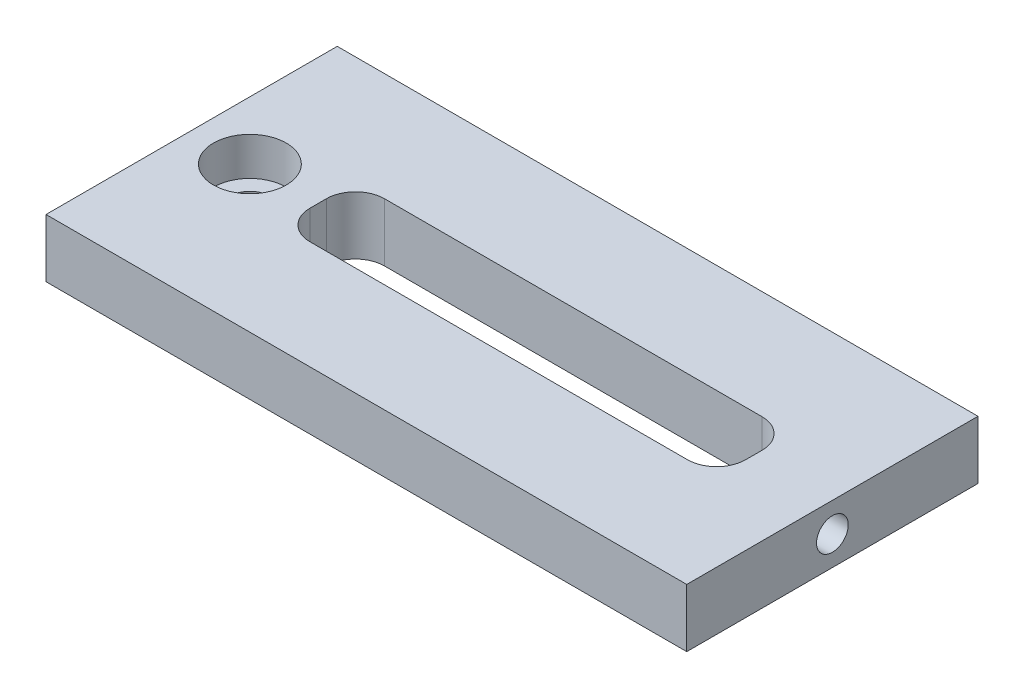
ISO-10303-21;
HEADER;
FILE_DESCRIPTION(('STEP AP214'),'2;1');
FILE_NAME('part.step','',(''),(''),'','','');
FILE_SCHEMA(('AUTOMOTIVE_DESIGN { 1 0 10303 214 1 1 1 1 }'));
ENDSEC;
DATA;
#1=APPLICATION_CONTEXT('core data for automotive mechanical design processes');
#2=APPLICATION_PROTOCOL_DEFINITION('international standard','automotive_design',2000,#1);
#3=PRODUCT_CONTEXT('',#1,'mechanical');
#4=PRODUCT('Part','Part','',(#3));
#5=PRODUCT_RELATED_PRODUCT_CATEGORY('part','',(#4));
#6=PRODUCT_DEFINITION_FORMATION('','',#4);
#7=PRODUCT_DEFINITION_CONTEXT('part definition',#1,'design');
#8=PRODUCT_DEFINITION('design','',#6,#7);
#9=PRODUCT_DEFINITION_SHAPE('','',#8);
#10=(LENGTH_UNIT() NAMED_UNIT(*) SI_UNIT(.MILLI.,.METRE.));
#11=(NAMED_UNIT(*) PLANE_ANGLE_UNIT() SI_UNIT($,.RADIAN.));
#12=(NAMED_UNIT(*) SI_UNIT($,.STERADIAN.) SOLID_ANGLE_UNIT());
#13=UNCERTAINTY_MEASURE_WITH_UNIT(LENGTH_MEASURE(1.E-05),#10,'distance_accuracy_value','');
#14=(GEOMETRIC_REPRESENTATION_CONTEXT(3) GLOBAL_UNCERTAINTY_ASSIGNED_CONTEXT((#13)) GLOBAL_UNIT_ASSIGNED_CONTEXT((#10,
#11,#12)) REPRESENTATION_CONTEXT('',''));
#15=CARTESIAN_POINT('',(0.,0.,0.));
#16=DIRECTION('',(0.,0.,1.));
#17=DIRECTION('',(1.,0.,0.));
#18=AXIS2_PLACEMENT_3D('',#15,#16,#17);
#19=CARTESIAN_POINT('',(26.3652,-3.175,4.064));
#20=DIRECTION('',(1.,0.,0.));
#21=DIRECTION('',(0.,0.,-1.));
#22=AXIS2_PLACEMENT_3D('',#19,#20,#21);
#23=PLANE('',#22);
#24=DIRECTION('',(0.,1.,0.));
#25=VECTOR('',#24,1.);
#26=CARTESIAN_POINT('',(26.3652,-3.175,-0.889000000000001));
#27=LINE('',#26,#25);
#28=CARTESIAN_POINT('',(26.3652,3.175,-0.889000000000001));
#29=VERTEX_POINT('',#28);
#30=CARTESIAN_POINT('',(26.3652,1.48084396207028,-0.889000000000001));
#31=VERTEX_POINT('',#30);
#32=EDGE_CURVE('E164',#29,#31,#27,.F.);
#33=ORIENTED_EDGE('',*,*,#32,.T.);
#34=CARTESIAN_POINT('',(26.3652,0.,0.));
#35=DIRECTION('',(1.,0.,0.));
#36=DIRECTION('',(0.,0.,-1.));
#37=AXIS2_PLACEMENT_3D('',#34,#35,#36);
#38=CIRCLE('',#37,1.72719999999999);
#39=CARTESIAN_POINT('',(26.3652,1.48084396207028,0.888999999999999));
#40=VERTEX_POINT('',#39);
#41=EDGE_CURVE('E11',#31,#40,#38,.T.);
#42=ORIENTED_EDGE('',*,*,#41,.T.);
#43=DIRECTION('',(0.,1.,0.));
#44=VECTOR('',#43,1.);
#45=CARTESIAN_POINT('',(26.3652,3.175,0.888999999999999));
#46=LINE('',#45,#44);
#47=CARTESIAN_POINT('',(26.3652,3.175,0.888999999999999));
#48=VERTEX_POINT('',#47);
#49=EDGE_CURVE('E172',#40,#48,#46,.T.);
#50=ORIENTED_EDGE('',*,*,#49,.T.);
#51=DIRECTION('',(0.,0.,-1.));
#52=VECTOR('',#51,1.);
#53=CARTESIAN_POINT('',(26.3652,3.175,4.064));
#54=LINE('',#53,#52);
#55=EDGE_CURVE('E170',#48,#29,#54,.T.);
#56=ORIENTED_EDGE('',*,*,#55,.T.);
#57=EDGE_LOOP('',(#33,#42,#50,#56));
#58=FACE_BOUND('',#57,.T.);
#59=ADVANCED_FACE('F42',(#58),#23,.F.);
#60=CARTESIAN_POINT('',(0.,3.175,0.));
#61=DIRECTION('',(0.,-1.,0.));
#62=DIRECTION('',(0.,0.,-1.));
#63=AXIS2_PLACEMENT_3D('',#60,#61,#62);
#64=PLANE('',#63);
#65=CARTESIAN_POINT('',(-28.575,3.175,0.));
#66=DIRECTION('',(0.,1.,0.));
#67=DIRECTION('',(0.,0.,1.));
#68=AXIS2_PLACEMENT_3D('',#65,#66,#67);
#69=CIRCLE('',#68,3.96875);
#70=CARTESIAN_POINT('',(-28.575,3.175,3.96875));
#71=VERTEX_POINT('',#70);
#72=EDGE_CURVE('E157',#71,#71,#69,.T.);
#73=ORIENTED_EDGE('',*,*,#72,.F.);
#74=EDGE_LOOP('',(#73));
#75=FACE_BOUND('',#74,.T.);
#76=DIRECTION('',(0.,0.,-1.));
#77=VECTOR('',#76,1.);
#78=CARTESIAN_POINT('',(-34.925,3.175,15.875));
#79=LINE('',#78,#77);
#80=CARTESIAN_POINT('',(-34.925,3.175,15.875));
#81=VERTEX_POINT('',#80);
#82=CARTESIAN_POINT('',(-34.925,3.175,-15.875));
#83=VERTEX_POINT('',#82);
#84=EDGE_CURVE('E231',#81,#83,#79,.T.);
#85=ORIENTED_EDGE('',*,*,#84,.F.);
#86=DIRECTION('',(1.,0.,0.));
#87=VECTOR('',#86,1.);
#88=CARTESIAN_POINT('',(-34.925,3.175,15.875));
#89=LINE('',#88,#87);
#90=CARTESIAN_POINT('',(34.925,3.175,15.875));
#91=VERTEX_POINT('',#90);
#92=EDGE_CURVE('E200',#81,#91,#89,.T.);
#93=ORIENTED_EDGE('',*,*,#92,.T.);
#94=DIRECTION('',(0.,0.,-1.));
#95=VECTOR('',#94,1.);
#96=CARTESIAN_POINT('',(34.925,3.175,15.875));
#97=LINE('',#96,#95);
#98=CARTESIAN_POINT('',(34.925,3.175,-15.875));
#99=VERTEX_POINT('',#98);
#100=EDGE_CURVE('E206',#91,#99,#97,.T.);
#101=ORIENTED_EDGE('',*,*,#100,.T.);
#102=DIRECTION('',(1.,0.,0.));
#103=VECTOR('',#102,1.);
#104=CARTESIAN_POINT('',(-34.925,3.175,-15.875));
#105=LINE('',#104,#103);
#106=EDGE_CURVE('E212',#83,#99,#105,.T.);
#107=ORIENTED_EDGE('',*,*,#106,.F.);
#108=EDGE_LOOP('',(#85,#93,#101,#107));
#109=FACE_BOUND('',#108,.T.);
#110=DIRECTION('',(1.,0.,0.));
#111=VECTOR('',#110,1.);
#112=CARTESIAN_POINT('',(-21.1328,3.175,4.064));
#113=LINE('',#112,#111);
#114=CARTESIAN_POINT('',(-17.9578,3.175,4.064));
#115=VERTEX_POINT('',#114);
#116=CARTESIAN_POINT('',(23.1902,3.175,4.064));
#117=VERTEX_POINT('',#116);
#118=EDGE_CURVE('E237',#115,#117,#113,.T.);
#119=ORIENTED_EDGE('',*,*,#118,.F.);
#120=CARTESIAN_POINT('',(-17.9578,3.175,0.888999999999999));
#121=DIRECTION('',(0.,-1.,0.));
#122=DIRECTION('',(0.,0.,-1.));
#123=AXIS2_PLACEMENT_3D('',#120,#121,#122);
#124=CIRCLE('',#123,3.175);
#125=CARTESIAN_POINT('',(-21.1328,3.175,0.888999999999999));
#126=VERTEX_POINT('',#125);
#127=EDGE_CURVE('E289',#115,#126,#124,.T.);
#128=ORIENTED_EDGE('',*,*,#127,.T.);
#129=DIRECTION('',(0.,0.,-1.));
#130=VECTOR('',#129,1.);
#131=CARTESIAN_POINT('',(-21.1328,3.175,4.064));
#132=LINE('',#131,#130);
#133=CARTESIAN_POINT('',(-21.1328,3.175,-0.889000000000001));
#134=VERTEX_POINT('',#133);
#135=EDGE_CURVE('E248',#126,#134,#132,.T.);
#136=ORIENTED_EDGE('',*,*,#135,.T.);
#137=CARTESIAN_POINT('',(-17.9578,3.175,-0.889000000000001));
#138=DIRECTION('',(0.,-1.,0.));
#139=DIRECTION('',(0.,0.,-1.));
#140=AXIS2_PLACEMENT_3D('',#137,#138,#139);
#141=CIRCLE('',#140,3.175);
#142=CARTESIAN_POINT('',(-17.9578,3.175,-4.064));
#143=VERTEX_POINT('',#142);
#144=EDGE_CURVE('E294',#134,#143,#141,.T.);
#145=ORIENTED_EDGE('',*,*,#144,.T.);
#146=DIRECTION('',(1.,0.,0.));
#147=VECTOR('',#146,1.);
#148=CARTESIAN_POINT('',(-21.1328,3.175,-4.064));
#149=LINE('',#148,#147);
#150=CARTESIAN_POINT('',(23.1902,3.175,-4.064));
#151=VERTEX_POINT('',#150);
#152=EDGE_CURVE('E244',#143,#151,#149,.T.);
#153=ORIENTED_EDGE('',*,*,#152,.T.);
#154=CARTESIAN_POINT('',(23.1902,3.175,-0.889000000000001));
#155=DIRECTION('',(0.,-1.,0.));
#156=DIRECTION('',(0.,0.,-1.));
#157=AXIS2_PLACEMENT_3D('',#154,#155,#156);
#158=CIRCLE('',#157,3.175);
#159=EDGE_CURVE('E300',#151,#29,#158,.T.);
#160=ORIENTED_EDGE('',*,*,#159,.T.);
#161=ORIENTED_EDGE('',*,*,#55,.F.);
#162=CARTESIAN_POINT('',(23.1902,3.175,0.888999999999999));
#163=DIRECTION('',(0.,-1.,0.));
#164=DIRECTION('',(0.,0.,-1.));
#165=AXIS2_PLACEMENT_3D('',#162,#163,#164);
#166=CIRCLE('',#165,3.175);
#167=EDGE_CURVE('E306',#48,#117,#166,.T.);
#168=ORIENTED_EDGE('',*,*,#167,.T.);
#169=EDGE_LOOP('',(#119,#128,#136,#145,#153,#160,#161,#168));
#170=FACE_BOUND('',#169,.T.);
#171=ADVANCED_FACE('F343',(#75,#109,#170),#64,.F.);
#172=CARTESIAN_POINT('',(0.,-3.175,0.));
#173=DIRECTION('',(0.,-1.,0.));
#174=DIRECTION('',(0.,0.,-1.));
#175=AXIS2_PLACEMENT_3D('',#172,#173,#174);
#176=PLANE('',#175);
#177=CARTESIAN_POINT('',(-28.575,-3.175,0.));
#178=DIRECTION('',(0.,-1.,0.));
#179=DIRECTION('',(0.,0.,-1.));
#180=AXIS2_PLACEMENT_3D('',#177,#178,#179);
#181=CIRCLE('',#180,2.2479);
#182=CARTESIAN_POINT('',(-28.575,-3.175,-2.2479));
#183=VERTEX_POINT('',#182);
#184=EDGE_CURVE('E252',#183,#183,#181,.T.);
#185=ORIENTED_EDGE('',*,*,#184,.F.);
#186=EDGE_LOOP('',(#185));
#187=FACE_BOUND('',#186,.T.);
#188=DIRECTION('',(0.,0.,-1.));
#189=VECTOR('',#188,1.);
#190=CARTESIAN_POINT('',(-34.925,-3.175,15.875));
#191=LINE('',#190,#189);
#192=CARTESIAN_POINT('',(-34.925,-3.175,15.875));
#193=VERTEX_POINT('',#192);
#194=CARTESIAN_POINT('',(-34.925,-3.175,-15.875));
#195=VERTEX_POINT('',#194);
#196=EDGE_CURVE('E216',#193,#195,#191,.T.);
#197=ORIENTED_EDGE('',*,*,#196,.T.);
#198=DIRECTION('',(1.,0.,0.));
#199=VECTOR('',#198,1.);
#200=CARTESIAN_POINT('',(-34.925,-3.175,-15.875));
#201=LINE('',#200,#199);
#202=CARTESIAN_POINT('',(34.925,-3.175,-15.875));
#203=VERTEX_POINT('',#202);
#204=EDGE_CURVE('E220',#195,#203,#201,.T.);
#205=ORIENTED_EDGE('',*,*,#204,.T.);
#206=DIRECTION('',(0.,0.,-1.));
#207=VECTOR('',#206,1.);
#208=CARTESIAN_POINT('',(34.925,-3.175,15.875));
#209=LINE('',#208,#207);
#210=CARTESIAN_POINT('',(34.925,-3.175,15.875));
#211=VERTEX_POINT('',#210);
#212=EDGE_CURVE('E224',#211,#203,#209,.T.);
#213=ORIENTED_EDGE('',*,*,#212,.F.);
#214=DIRECTION('',(1.,0.,0.));
#215=VECTOR('',#214,1.);
#216=CARTESIAN_POINT('',(-34.925,-3.175,15.875));
#217=LINE('',#216,#215);
#218=EDGE_CURVE('E194',#193,#211,#217,.T.);
#219=ORIENTED_EDGE('',*,*,#218,.F.);
#220=EDGE_LOOP('',(#197,#205,#213,#219));
#221=FACE_BOUND('',#220,.T.);
#222=DIRECTION('',(1.,0.,0.));
#223=VECTOR('',#222,1.);
#224=CARTESIAN_POINT('',(-21.1328,-3.175,-4.064));
#225=LINE('',#224,#223);
#226=CARTESIAN_POINT('',(-17.9578,-3.175,-4.064));
#227=VERTEX_POINT('',#226);
#228=CARTESIAN_POINT('',(23.1902,-3.175,-4.064));
#229=VERTEX_POINT('',#228);
#230=EDGE_CURVE('E259',#227,#229,#225,.T.);
#231=ORIENTED_EDGE('',*,*,#230,.F.);
#232=CARTESIAN_POINT('',(-17.9578,-3.175,-0.889000000000001));
#233=DIRECTION('',(0.,-1.,0.));
#234=DIRECTION('',(0.,0.,-1.));
#235=AXIS2_PLACEMENT_3D('',#232,#233,#234);
#236=CIRCLE('',#235,3.175);
#237=CARTESIAN_POINT('',(-21.1328,-3.175,-0.889000000000001));
#238=VERTEX_POINT('',#237);
#239=EDGE_CURVE('E66',#227,#238,#236,.F.);
#240=ORIENTED_EDGE('',*,*,#239,.T.);
#241=DIRECTION('',(0.,0.,-1.));
#242=VECTOR('',#241,1.);
#243=CARTESIAN_POINT('',(-21.1328,-3.175,4.064));
#244=LINE('',#243,#242);
#245=CARTESIAN_POINT('',(-21.1328,-3.175,0.888999999999999));
#246=VERTEX_POINT('',#245);
#247=EDGE_CURVE('E241',#246,#238,#244,.T.);
#248=ORIENTED_EDGE('',*,*,#247,.F.);
#249=CARTESIAN_POINT('',(-17.9578,-3.175,0.888999999999999));
#250=DIRECTION('',(0.,-1.,0.));
#251=DIRECTION('',(0.,0.,-1.));
#252=AXIS2_PLACEMENT_3D('',#249,#250,#251);
#253=CIRCLE('',#252,3.175);
#254=CARTESIAN_POINT('',(-17.9578,-3.175,4.064));
#255=VERTEX_POINT('',#254);
#256=EDGE_CURVE('E286',#246,#255,#253,.F.);
#257=ORIENTED_EDGE('',*,*,#256,.T.);
#258=DIRECTION('',(1.,0.,0.));
#259=VECTOR('',#258,1.);
#260=CARTESIAN_POINT('',(-21.1328,-3.175,4.064));
#261=LINE('',#260,#259);
#262=CARTESIAN_POINT('',(23.1902,-3.175,4.064));
#263=VERTEX_POINT('',#262);
#264=EDGE_CURVE('E221',#255,#263,#261,.T.);
#265=ORIENTED_EDGE('',*,*,#264,.T.);
#266=CARTESIAN_POINT('',(23.1902,-3.175,0.888999999999999));
#267=DIRECTION('',(0.,-1.,0.));
#268=DIRECTION('',(0.,0.,-1.));
#269=AXIS2_PLACEMENT_3D('',#266,#267,#268);
#270=CIRCLE('',#269,3.175);
#271=CARTESIAN_POINT('',(26.3652,-3.175,0.888999999999999));
#272=VERTEX_POINT('',#271);
#273=EDGE_CURVE('E303',#263,#272,#270,.F.);
#274=ORIENTED_EDGE('',*,*,#273,.T.);
#275=DIRECTION('',(0.,0.,-1.));
#276=VECTOR('',#275,1.);
#277=CARTESIAN_POINT('',(26.3652,-3.175,4.064));
#278=LINE('',#277,#276);
#279=CARTESIAN_POINT('',(26.3652,-3.175,-0.889000000000001));
#280=VERTEX_POINT('',#279);
#281=EDGE_CURVE('E256',#272,#280,#278,.T.);
#282=ORIENTED_EDGE('',*,*,#281,.T.);
#283=CARTESIAN_POINT('',(23.1902,-3.175,-0.889000000000001));
#284=DIRECTION('',(0.,-1.,0.));
#285=DIRECTION('',(0.,0.,-1.));
#286=AXIS2_PLACEMENT_3D('',#283,#284,#285);
#287=CIRCLE('',#286,3.175);
#288=EDGE_CURVE('E297',#280,#229,#287,.F.);
#289=ORIENTED_EDGE('',*,*,#288,.T.);
#290=EDGE_LOOP('',(#231,#240,#248,#257,#265,#274,#282,#289));
#291=FACE_BOUND('',#290,.T.);
#292=ADVANCED_FACE('F349',(#187,#221,#291),#176,.T.);
#293=CARTESIAN_POINT('',(-34.925,3.175,15.875));
#294=DIRECTION('',(-1.,0.,0.));
#295=DIRECTION('',(0.,0.,1.));
#296=AXIS2_PLACEMENT_3D('',#293,#294,#295);
#297=PLANE('',#296);
#298=ORIENTED_EDGE('',*,*,#196,.F.);
#299=DIRECTION('',(0.,-1.,0.));
#300=VECTOR('',#299,1.);
#301=CARTESIAN_POINT('',(-34.925,3.175,15.875));
#302=LINE('',#301,#300);
#303=EDGE_CURVE('E179',#81,#193,#302,.T.);
#304=ORIENTED_EDGE('',*,*,#303,.F.);
#305=ORIENTED_EDGE('',*,*,#84,.T.);
#306=DIRECTION('',(0.,-1.,0.));
#307=VECTOR('',#306,1.);
#308=CARTESIAN_POINT('',(-34.925,3.175,-15.875));
#309=LINE('',#308,#307);
#310=EDGE_CURVE('E198',#83,#195,#309,.T.);
#311=ORIENTED_EDGE('',*,*,#310,.T.);
#312=EDGE_LOOP('',(#298,#304,#305,#311));
#313=FACE_BOUND('',#312,.T.);
#314=ADVANCED_FACE('F385',(#313),#297,.T.);
#315=CARTESIAN_POINT('',(-34.925,3.175,15.875));
#316=DIRECTION('',(0.,0.,-1.));
#317=DIRECTION('',(-1.,0.,0.));
#318=AXIS2_PLACEMENT_3D('',#315,#316,#317);
#319=PLANE('',#318);
#320=ORIENTED_EDGE('',*,*,#218,.T.);
#321=DIRECTION('',(0.,-1.,0.));
#322=VECTOR('',#321,1.);
#323=CARTESIAN_POINT('',(34.925,3.175,15.875));
#324=LINE('',#323,#322);
#325=EDGE_CURVE('E184',#91,#211,#324,.T.);
#326=ORIENTED_EDGE('',*,*,#325,.F.);
#327=ORIENTED_EDGE('',*,*,#92,.F.);
#328=ORIENTED_EDGE('',*,*,#303,.T.);
#329=EDGE_LOOP('',(#320,#326,#327,#328));
#330=FACE_BOUND('',#329,.T.);
#331=ADVANCED_FACE('F391',(#330),#319,.F.);
#332=CARTESIAN_POINT('',(34.925,3.175,15.875));
#333=DIRECTION('',(-1.,0.,0.));
#334=DIRECTION('',(0.,0.,1.));
#335=AXIS2_PLACEMENT_3D('',#332,#333,#334);
#336=PLANE('',#335);
#337=CARTESIAN_POINT('',(34.925,0.,0.));
#338=DIRECTION('',(1.,0.,0.));
#339=DIRECTION('',(0.,0.,-1.));
#340=AXIS2_PLACEMENT_3D('',#337,#338,#339);
#341=CIRCLE('',#340,1.72719999999999);
#342=CARTESIAN_POINT('',(34.925,0.,-1.72719999999999));
#343=VERTEX_POINT('',#342);
#344=EDGE_CURVE('E276',#343,#343,#341,.T.);
#345=ORIENTED_EDGE('',*,*,#344,.F.);
#346=EDGE_LOOP('',(#345));
#347=FACE_BOUND('',#346,.T.);
#348=ORIENTED_EDGE('',*,*,#212,.T.);
#349=DIRECTION('',(0.,-1.,0.));
#350=VECTOR('',#349,1.);
#351=CARTESIAN_POINT('',(34.925,3.175,-15.875));
#352=LINE('',#351,#350);
#353=EDGE_CURVE('E191',#99,#203,#352,.T.);
#354=ORIENTED_EDGE('',*,*,#353,.F.);
#355=ORIENTED_EDGE('',*,*,#100,.F.);
#356=ORIENTED_EDGE('',*,*,#325,.T.);
#357=EDGE_LOOP('',(#348,#354,#355,#356));
#358=FACE_BOUND('',#357,.T.);
#359=ADVANCED_FACE('F394',(#347,#358),#336,.F.);
#360=CARTESIAN_POINT('',(-34.925,3.175,-15.875));
#361=DIRECTION('',(0.,0.,-1.));
#362=DIRECTION('',(-1.,0.,0.));
#363=AXIS2_PLACEMENT_3D('',#360,#361,#362);
#364=PLANE('',#363);
#365=ORIENTED_EDGE('',*,*,#204,.F.);
#366=ORIENTED_EDGE('',*,*,#310,.F.);
#367=ORIENTED_EDGE('',*,*,#106,.T.);
#368=ORIENTED_EDGE('',*,*,#353,.T.);
#369=EDGE_LOOP('',(#365,#366,#367,#368));
#370=FACE_BOUND('',#369,.T.);
#371=ADVANCED_FACE('F397',(#370),#364,.T.);
#372=CARTESIAN_POINT('',(-21.1328,-3.175,4.064));
#373=DIRECTION('',(1.,0.,0.));
#374=DIRECTION('',(0.,0.,-1.));
#375=AXIS2_PLACEMENT_3D('',#372,#373,#374);
#376=PLANE('',#375);
#377=ORIENTED_EDGE('',*,*,#247,.T.);
#378=DIRECTION('',(0.,1.,0.));
#379=VECTOR('',#378,1.);
#380=CARTESIAN_POINT('',(-21.1328,3.175,-0.889000000000001));
#381=LINE('',#380,#379);
#382=EDGE_CURVE('E309',#238,#134,#381,.T.);
#383=ORIENTED_EDGE('',*,*,#382,.T.);
#384=ORIENTED_EDGE('',*,*,#135,.F.);
#385=DIRECTION('',(0.,1.,0.));
#386=VECTOR('',#385,1.);
#387=CARTESIAN_POINT('',(-21.1328,-3.175,0.888999999999999));
#388=LINE('',#387,#386);
#389=EDGE_CURVE('E313',#126,#246,#388,.F.);
#390=ORIENTED_EDGE('',*,*,#389,.T.);
#391=EDGE_LOOP('',(#377,#383,#384,#390));
#392=FACE_BOUND('',#391,.T.);
#393=ADVANCED_FACE('F355',(#392),#376,.T.);
#394=CARTESIAN_POINT('',(-21.1328,-3.175,-4.064));
#395=DIRECTION('',(0.,0.,1.));
#396=DIRECTION('',(1.,0.,0.));
#397=AXIS2_PLACEMENT_3D('',#394,#395,#396);
#398=PLANE('',#397);
#399=ORIENTED_EDGE('',*,*,#230,.T.);
#400=DIRECTION('',(0.,1.,0.));
#401=VECTOR('',#400,1.);
#402=CARTESIAN_POINT('',(23.1902,-3.175,-4.064));
#403=LINE('',#402,#401);
#404=EDGE_CURVE('E316',#229,#151,#403,.T.);
#405=ORIENTED_EDGE('',*,*,#404,.T.);
#406=ORIENTED_EDGE('',*,*,#152,.F.);
#407=DIRECTION('',(0.,1.,0.));
#408=VECTOR('',#407,1.);
#409=CARTESIAN_POINT('',(-17.9578,-3.175,-4.064));
#410=LINE('',#409,#408);
#411=EDGE_CURVE('E320',#143,#227,#410,.F.);
#412=ORIENTED_EDGE('',*,*,#411,.T.);
#413=EDGE_LOOP('',(#399,#405,#406,#412));
#414=FACE_BOUND('',#413,.T.);
#415=ADVANCED_FACE('F347',(#414),#398,.T.);
#416=CARTESIAN_POINT('',(26.3652,-1.48084396207026,0.888999999999999));
#417=VERTEX_POINT('',#416);
#418=EDGE_CURVE('E176',#272,#417,#46,.T.);
#419=ORIENTED_EDGE('',*,*,#418,.T.);
#420=CARTESIAN_POINT('',(26.3652,-1.48084396207026,-0.889000000000001));
#421=VERTEX_POINT('',#420);
#422=EDGE_CURVE('E46',#417,#421,#38,.T.);
#423=ORIENTED_EDGE('',*,*,#422,.T.);
#424=EDGE_CURVE('E165',#421,#280,#27,.F.);
#425=ORIENTED_EDGE('',*,*,#424,.T.);
#426=ORIENTED_EDGE('',*,*,#281,.F.);
#427=EDGE_LOOP('',(#419,#423,#425,#426));
#428=FACE_BOUND('',#427,.T.);
#429=ADVANCED_FACE('F363',(#428),#23,.F.);
#430=CARTESIAN_POINT('',(-21.1328,-3.175,4.064));
#431=DIRECTION('',(0.,0.,1.));
#432=DIRECTION('',(1.,0.,0.));
#433=AXIS2_PLACEMENT_3D('',#430,#431,#432);
#434=PLANE('',#433);
#435=ORIENTED_EDGE('',*,*,#118,.T.);
#436=DIRECTION('',(0.,1.,0.));
#437=VECTOR('',#436,1.);
#438=CARTESIAN_POINT('',(23.1902,-3.175,4.064));
#439=LINE('',#438,#437);
#440=EDGE_CURVE('E323',#117,#263,#439,.F.);
#441=ORIENTED_EDGE('',*,*,#440,.T.);
#442=ORIENTED_EDGE('',*,*,#264,.F.);
#443=DIRECTION('',(0.,1.,0.));
#444=VECTOR('',#443,1.);
#445=CARTESIAN_POINT('',(-17.9578,-3.175,4.064));
#446=LINE('',#445,#444);
#447=EDGE_CURVE('E326',#255,#115,#446,.T.);
#448=ORIENTED_EDGE('',*,*,#447,.T.);
#449=EDGE_LOOP('',(#435,#441,#442,#448));
#450=FACE_BOUND('',#449,.T.);
#451=ADVANCED_FACE('F362',(#450),#434,.F.);
#452=CARTESIAN_POINT('',(23.1902,-3.175,0.888999999999999));
#453=DIRECTION('',(0.,-1.,0.));
#454=DIRECTION('',(0.,0.,-1.));
#455=AXIS2_PLACEMENT_3D('',#452,#453,#454);
#456=CYLINDRICAL_SURFACE('',#455,3.175);
#457=ORIENTED_EDGE('',*,*,#273,.F.);
#458=ORIENTED_EDGE('',*,*,#440,.F.);
#459=ORIENTED_EDGE('',*,*,#167,.F.);
#460=ORIENTED_EDGE('',*,*,#49,.F.);
#461=EDGE_CURVE('E174',#417,#40,#46,.T.);
#462=ORIENTED_EDGE('',*,*,#461,.F.);
#463=ORIENTED_EDGE('',*,*,#418,.F.);
#464=EDGE_LOOP('',(#457,#458,#459,#460,#462,#463));
#465=FACE_BOUND('',#464,.T.);
#466=ADVANCED_FACE('F338',(#465),#456,.F.);
#467=CARTESIAN_POINT('',(23.1902,-3.175,-0.889000000000001));
#468=DIRECTION('',(0.,1.,0.));
#469=DIRECTION('',(0.,0.,1.));
#470=AXIS2_PLACEMENT_3D('',#467,#468,#469);
#471=CYLINDRICAL_SURFACE('',#470,3.175);
#472=ORIENTED_EDGE('',*,*,#288,.F.);
#473=ORIENTED_EDGE('',*,*,#424,.F.);
#474=EDGE_CURVE('E155',#31,#421,#27,.F.);
#475=ORIENTED_EDGE('',*,*,#474,.F.);
#476=ORIENTED_EDGE('',*,*,#32,.F.);
#477=ORIENTED_EDGE('',*,*,#159,.F.);
#478=ORIENTED_EDGE('',*,*,#404,.F.);
#479=EDGE_LOOP('',(#472,#473,#475,#476,#477,#478));
#480=FACE_BOUND('',#479,.T.);
#481=ADVANCED_FACE('F163',(#480),#471,.F.);
#482=CARTESIAN_POINT('',(-17.9578,-3.175,-0.889000000000001));
#483=DIRECTION('',(0.,-1.,0.));
#484=DIRECTION('',(0.,0.,-1.));
#485=AXIS2_PLACEMENT_3D('',#482,#483,#484);
#486=CYLINDRICAL_SURFACE('',#485,3.175);
#487=ORIENTED_EDGE('',*,*,#239,.F.);
#488=ORIENTED_EDGE('',*,*,#411,.F.);
#489=ORIENTED_EDGE('',*,*,#144,.F.);
#490=ORIENTED_EDGE('',*,*,#382,.F.);
#491=EDGE_LOOP('',(#487,#488,#489,#490));
#492=FACE_BOUND('',#491,.T.);
#493=ADVANCED_FACE('F352',(#492),#486,.F.);
#494=CARTESIAN_POINT('',(-17.9578,-3.175,0.888999999999999));
#495=DIRECTION('',(0.,1.,0.));
#496=DIRECTION('',(0.,0.,1.));
#497=AXIS2_PLACEMENT_3D('',#494,#495,#496);
#498=CYLINDRICAL_SURFACE('',#497,3.175);
#499=ORIENTED_EDGE('',*,*,#256,.F.);
#500=ORIENTED_EDGE('',*,*,#389,.F.);
#501=ORIENTED_EDGE('',*,*,#127,.F.);
#502=ORIENTED_EDGE('',*,*,#447,.F.);
#503=EDGE_LOOP('',(#499,#500,#501,#502));
#504=FACE_BOUND('',#503,.T.);
#505=ADVANCED_FACE('F44',(#504),#498,.F.);
#506=CARTESIAN_POINT('',(-28.575,3.175,0.));
#507=DIRECTION('',(0.,1.,0.));
#508=DIRECTION('',(0.,0.,1.));
#509=AXIS2_PLACEMENT_3D('',#506,#507,#508);
#510=CYLINDRICAL_SURFACE('',#509,2.2479);
#511=ORIENTED_EDGE('',*,*,#184,.T.);
#512=EDGE_LOOP('',(#511));
#513=FACE_BOUND('',#512,.T.);
#514=CARTESIAN_POINT('',(-28.575,-0.9906,0.));
#515=DIRECTION('',(0.,1.,0.));
#516=DIRECTION('',(0.,0.,1.));
#517=AXIS2_PLACEMENT_3D('',#514,#515,#516);
#518=CIRCLE('',#517,2.2479);
#519=CARTESIAN_POINT('',(-28.575,-0.9906,2.2479));
#520=VERTEX_POINT('',#519);
#521=EDGE_CURVE('E265',#520,#520,#518,.T.);
#522=ORIENTED_EDGE('',*,*,#521,.T.);
#523=EDGE_LOOP('',(#522));
#524=FACE_BOUND('',#523,.T.);
#525=ADVANCED_FACE('F411',(#513,#524),#510,.F.);
#526=CARTESIAN_POINT('',(-26.3271,-0.9906,0.));
#527=DIRECTION('',(0.,-1.,0.));
#528=DIRECTION('',(0.,0.,-1.));
#529=AXIS2_PLACEMENT_3D('',#526,#527,#528);
#530=PLANE('',#529);
#531=ORIENTED_EDGE('',*,*,#521,.F.);
#532=EDGE_LOOP('',(#531));
#533=FACE_BOUND('',#532,.T.);
#534=CARTESIAN_POINT('',(-28.575,-0.9906,0.));
#535=DIRECTION('',(0.,1.,0.));
#536=DIRECTION('',(0.,0.,1.));
#537=AXIS2_PLACEMENT_3D('',#534,#535,#536);
#538=CIRCLE('',#537,3.96875);
#539=CARTESIAN_POINT('',(-28.575,-0.9906,3.96875));
#540=VERTEX_POINT('',#539);
#541=EDGE_CURVE('E269',#540,#540,#538,.T.);
#542=ORIENTED_EDGE('',*,*,#541,.T.);
#543=EDGE_LOOP('',(#542));
#544=FACE_BOUND('',#543,.T.);
#545=ADVANCED_FACE('F414',(#533,#544),#530,.F.);
#546=CARTESIAN_POINT('',(-28.575,3.175,0.));
#547=DIRECTION('',(0.,1.,0.));
#548=DIRECTION('',(0.,0.,1.));
#549=AXIS2_PLACEMENT_3D('',#546,#547,#548);
#550=CYLINDRICAL_SURFACE('',#549,3.96875);
#551=ORIENTED_EDGE('',*,*,#541,.F.);
#552=EDGE_LOOP('',(#551));
#553=FACE_BOUND('',#552,.T.);
#554=ORIENTED_EDGE('',*,*,#72,.T.);
#555=EDGE_LOOP('',(#554));
#556=FACE_BOUND('',#555,.T.);
#557=ADVANCED_FACE('F419',(#553,#556),#550,.F.);
#558=CARTESIAN_POINT('',(26.3652,-3.175,4.064));
#559=DIRECTION('',(1.,0.,0.));
#560=DIRECTION('',(0.,0.,-1.));
#561=AXIS2_PLACEMENT_3D('',#558,#559,#560);
#562=PLANE('',#561);
#563=ORIENTED_EDGE('',*,*,#474,.T.);
#564=CARTESIAN_POINT('',(26.3652,0.,0.));
#565=DIRECTION('',(1.,0.,0.));
#566=DIRECTION('',(0.,0.,-1.));
#567=AXIS2_PLACEMENT_3D('',#564,#565,#566);
#568=CIRCLE('',#567,1.72719999999999);
#569=EDGE_CURVE('E147',#31,#421,#568,.F.);
#570=ORIENTED_EDGE('',*,*,#569,.F.);
#571=EDGE_LOOP('',(#563,#570));
#572=FACE_BOUND('',#571,.T.);
#573=ADVANCED_FACE('F154',(#572),#562,.T.);
#574=ORIENTED_EDGE('',*,*,#461,.T.);
#575=EDGE_CURVE('E58',#417,#40,#568,.F.);
#576=ORIENTED_EDGE('',*,*,#575,.F.);
#577=EDGE_LOOP('',(#574,#576));
#578=FACE_BOUND('',#577,.T.);
#579=ADVANCED_FACE('F335',(#578),#562,.T.);
#580=CARTESIAN_POINT('',(34.925,0.,0.));
#581=DIRECTION('',(1.,0.,0.));
#582=DIRECTION('',(0.,0.,-1.));
#583=AXIS2_PLACEMENT_3D('',#580,#581,#582);
#584=CYLINDRICAL_SURFACE('',#583,1.72719999999999);
#585=ORIENTED_EDGE('',*,*,#575,.T.);
#586=ORIENTED_EDGE('',*,*,#41,.F.);
#587=ORIENTED_EDGE('',*,*,#569,.T.);
#588=ORIENTED_EDGE('',*,*,#422,.F.);
#589=EDGE_LOOP('',(#585,#586,#587,#588));
#590=FACE_BOUND('',#589,.T.);
#591=ORIENTED_EDGE('',*,*,#344,.T.);
#592=EDGE_LOOP('',(#591));
#593=FACE_BOUND('',#592,.T.);
#594=ADVANCED_FACE('F145',(#590,#593),#584,.F.);
#595=CLOSED_SHELL('',(#59,#171,#292,#314,#331,#359,#371,#393,#415,#429,#451,#466,#481,#493,#505,
#525,#545,#557,#573,#579,#594));
#596=MANIFOLD_SOLID_BREP('B2',#595);
#597=ADVANCED_BREP_SHAPE_REPRESENTATION('',(#18,#596),#14);
#598=SHAPE_DEFINITION_REPRESENTATION(#9,#597);
ENDSEC;
END-ISO-10303-21;
